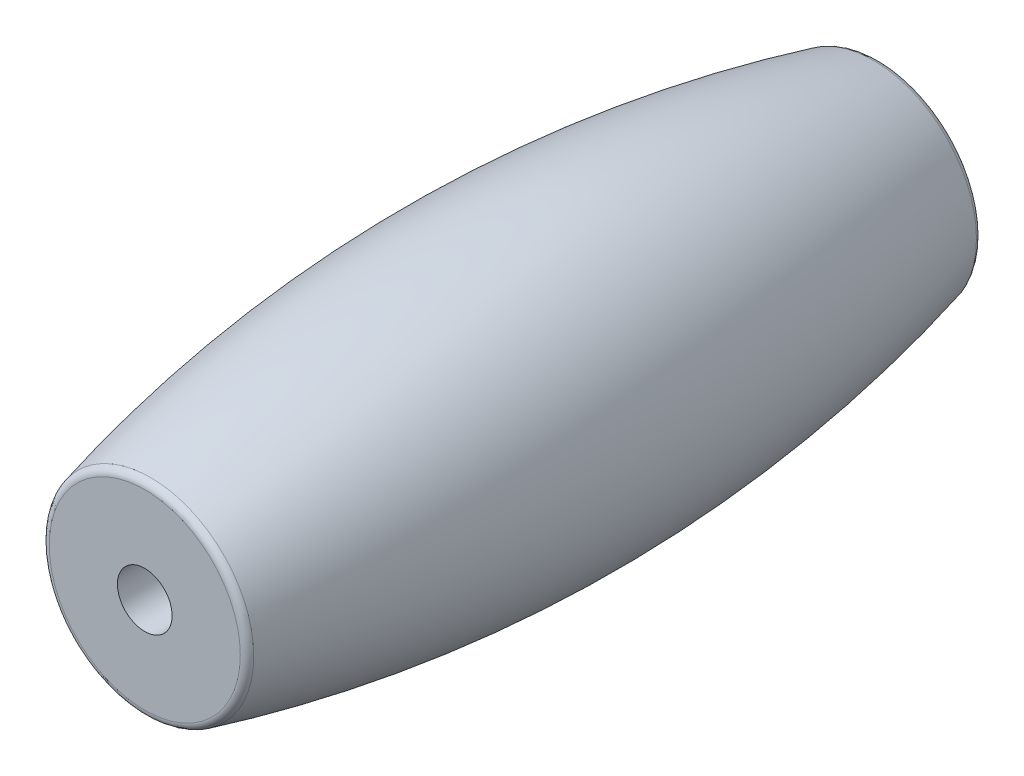
ISO-10303-21;
HEADER;
FILE_DESCRIPTION(('STEP AP214'),'2;1');
FILE_NAME('part.step','',(''),(''),'','','');
FILE_SCHEMA(('AUTOMOTIVE_DESIGN { 1 0 10303 214 1 1 1 1 }'));
ENDSEC;
DATA;
#1=APPLICATION_CONTEXT('core data for automotive mechanical design processes');
#2=APPLICATION_PROTOCOL_DEFINITION('international standard','automotive_design',2000,#1);
#3=PRODUCT_CONTEXT('',#1,'mechanical');
#4=PRODUCT('Part','Part','',(#3));
#5=PRODUCT_RELATED_PRODUCT_CATEGORY('part','',(#4));
#6=PRODUCT_DEFINITION_FORMATION('','',#4);
#7=PRODUCT_DEFINITION_CONTEXT('part definition',#1,'design');
#8=PRODUCT_DEFINITION('design','',#6,#7);
#9=PRODUCT_DEFINITION_SHAPE('','',#8);
#10=(LENGTH_UNIT() NAMED_UNIT(*) SI_UNIT(.MILLI.,.METRE.));
#11=(NAMED_UNIT(*) PLANE_ANGLE_UNIT() SI_UNIT($,.RADIAN.));
#12=(NAMED_UNIT(*) SI_UNIT($,.STERADIAN.) SOLID_ANGLE_UNIT());
#13=UNCERTAINTY_MEASURE_WITH_UNIT(LENGTH_MEASURE(1.E-05),#10,'distance_accuracy_value','');
#14=(GEOMETRIC_REPRESENTATION_CONTEXT(3) GLOBAL_UNCERTAINTY_ASSIGNED_CONTEXT((#13)) GLOBAL_UNIT_ASSIGNED_CONTEXT((#10,
#11,#12)) REPRESENTATION_CONTEXT('',''));
#15=CARTESIAN_POINT('',(0.,0.,0.));
#16=DIRECTION('',(0.,0.,1.));
#17=DIRECTION('',(1.,0.,0.));
#18=AXIS2_PLACEMENT_3D('',#15,#16,#17);
#19=CARTESIAN_POINT('',(0.,0.,-14.8279808754877));
#20=DIRECTION('',(0.,0.,1.));
#21=DIRECTION('',(1.,0.,0.));
#22=AXIS2_PLACEMENT_3D('',#19,#20,#21);
#23=PLANE('',#22);
#24=CARTESIAN_POINT('',(0.,0.,-14.8279808754877));
#25=DIRECTION('',(0.,0.,1.));
#26=DIRECTION('',(1.,0.,0.));
#27=AXIS2_PLACEMENT_3D('',#24,#25,#26);
#28=CIRCLE('',#27,6.11237781338488);
#29=CARTESIAN_POINT('',(6.11237781338487,0.,-14.8279808754877));
#30=VERTEX_POINT('',#29);
#31=EDGE_CURVE('E10',#30,#30,#28,.F.);
#32=ORIENTED_EDGE('',*,*,#31,.T.);
#33=EDGE_LOOP('',(#32));
#34=FACE_BOUND('',#33,.T.);
#35=CARTESIAN_POINT('',(0.,0.,-14.8279808754877));
#36=DIRECTION('',(0.,0.,1.));
#37=DIRECTION('',(1.,0.,0.));
#38=AXIS2_PLACEMENT_3D('',#35,#36,#37);
#39=CIRCLE('',#38,1.75);
#40=CARTESIAN_POINT('',(1.75,0.,-14.8279808754877));
#41=VERTEX_POINT('',#40);
#42=EDGE_CURVE('E55',#41,#41,#39,.T.);
#43=ORIENTED_EDGE('',*,*,#42,.T.);
#44=EDGE_LOOP('',(#43));
#45=FACE_BOUND('',#44,.T.);
#46=ADVANCED_FACE('F35',(#34,#45),#23,.F.);
#47=CARTESIAN_POINT('',(0.,0.,8.67201912451233));
#48=DIRECTION('',(0.,0.,-1.));
#49=DIRECTION('',(-1.,0.,0.));
#50=AXIS2_PLACEMENT_3D('',#47,#48,#49);
#51=DEGENERATE_TOROIDAL_SURFACE('',#50,84.0416666666667,93.5416666666667,.F.);
#52=CARTESIAN_POINT('',(0.,0.,31.795619661906));
#53=DIRECTION('',(0.,0.,-1.));
#54=DIRECTION('',(-1.,0.,0.));
#55=AXIS2_PLACEMENT_3D('',#52,#53,#54);
#56=CIRCLE('',#55,6.59685991538247);
#57=CARTESIAN_POINT('',(-6.59685991538246,0.,31.795619661906));
#58=VERTEX_POINT('',#57);
#59=EDGE_CURVE('E46',#58,#58,#56,.T.);
#60=ORIENTED_EDGE('',*,*,#59,.T.);
#61=EDGE_LOOP('',(#60));
#62=FACE_BOUND('',#61,.T.);
#63=CARTESIAN_POINT('',(0.,0.,-14.4515814128813));
#64=DIRECTION('',(0.,0.,1.));
#65=DIRECTION('',(1.,0.,0.));
#66=AXIS2_PLACEMENT_3D('',#63,#64,#65);
#67=CIRCLE('',#66,6.59685991538247);
#68=CARTESIAN_POINT('',(6.59685991538246,0.,-14.4515814128813));
#69=VERTEX_POINT('',#68);
#70=EDGE_CURVE('E50',#69,#69,#67,.T.);
#71=ORIENTED_EDGE('',*,*,#70,.T.);
#72=EDGE_LOOP('',(#71));
#73=FACE_BOUND('',#72,.T.);
#74=ADVANCED_FACE('F72',(#62,#73),#51,.F.);
#75=CARTESIAN_POINT('',(0.,0.,32.1720191245123));
#76=DIRECTION('',(0.,0.,-1.));
#77=DIRECTION('',(-1.,0.,0.));
#78=AXIS2_PLACEMENT_3D('',#75,#76,#77);
#79=PLANE('',#78);
#80=CARTESIAN_POINT('',(0.,0.,32.1720191245123));
#81=DIRECTION('',(0.,0.,-1.));
#82=DIRECTION('',(-1.,0.,0.));
#83=AXIS2_PLACEMENT_3D('',#80,#81,#82);
#84=CIRCLE('',#83,6.11237781338488);
#85=CARTESIAN_POINT('',(-6.11237781338487,0.,32.1720191245123));
#86=VERTEX_POINT('',#85);
#87=EDGE_CURVE('E42',#86,#86,#84,.F.);
#88=ORIENTED_EDGE('',*,*,#87,.T.);
#89=EDGE_LOOP('',(#88));
#90=FACE_BOUND('',#89,.T.);
#91=CARTESIAN_POINT('',(0.,0.,32.1720191245123));
#92=DIRECTION('',(0.,0.,1.));
#93=DIRECTION('',(1.,0.,0.));
#94=AXIS2_PLACEMENT_3D('',#91,#92,#93);
#95=CIRCLE('',#94,1.75);
#96=CARTESIAN_POINT('',(1.75,0.,32.1720191245123));
#97=VERTEX_POINT('',#96);
#98=EDGE_CURVE('E56',#97,#97,#95,.T.);
#99=ORIENTED_EDGE('',*,*,#98,.F.);
#100=EDGE_LOOP('',(#99));
#101=FACE_BOUND('',#100,.T.);
#102=ADVANCED_FACE('F67',(#90,#101),#79,.F.);
#103=CARTESIAN_POINT('',(0.,0.,-14.8279808754877));
#104=DIRECTION('',(0.,0.,1.));
#105=DIRECTION('',(1.,0.,0.));
#106=AXIS2_PLACEMENT_3D('',#103,#104,#105);
#107=CYLINDRICAL_SURFACE('',#106,1.75);
#108=ORIENTED_EDGE('',*,*,#42,.F.);
#109=EDGE_LOOP('',(#108));
#110=FACE_BOUND('',#109,.T.);
#111=ORIENTED_EDGE('',*,*,#98,.T.);
#112=EDGE_LOOP('',(#111));
#113=FACE_BOUND('',#112,.T.);
#114=ADVANCED_FACE('F63',(#110,#113),#107,.F.);
#115=CARTESIAN_POINT('',(0.,0.,31.6720191245123));
#116=DIRECTION('',(0.,0.,-1.));
#117=DIRECTION('',(-1.,0.,0.));
#118=AXIS2_PLACEMENT_3D('',#115,#116,#117);
#119=TOROIDAL_SURFACE('',#118,6.11237781338488,0.5);
#120=ORIENTED_EDGE('',*,*,#87,.F.);
#121=EDGE_LOOP('',(#120));
#122=FACE_BOUND('',#121,.T.);
#123=ORIENTED_EDGE('',*,*,#59,.F.);
#124=EDGE_LOOP('',(#123));
#125=FACE_BOUND('',#124,.T.);
#126=ADVANCED_FACE('F66',(#122,#125),#119,.T.);
#127=CARTESIAN_POINT('',(0.,0.,-14.3279808754877));
#128=DIRECTION('',(0.,0.,1.));
#129=DIRECTION('',(1.,0.,0.));
#130=AXIS2_PLACEMENT_3D('',#127,#128,#129);
#131=TOROIDAL_SURFACE('',#130,6.11237781338488,0.5);
#132=ORIENTED_EDGE('',*,*,#70,.F.);
#133=EDGE_LOOP('',(#132));
#134=FACE_BOUND('',#133,.T.);
#135=ORIENTED_EDGE('',*,*,#31,.F.);
#136=EDGE_LOOP('',(#135));
#137=FACE_BOUND('',#136,.T.);
#138=ADVANCED_FACE('F37',(#134,#137),#131,.T.);
#139=CLOSED_SHELL('',(#46,#74,#102,#114,#126,#138));
#140=MANIFOLD_SOLID_BREP('B2',#139);
#141=ADVANCED_BREP_SHAPE_REPRESENTATION('',(#18,#140),#14);
#142=SHAPE_DEFINITION_REPRESENTATION(#9,#141);
ENDSEC;
END-ISO-10303-21;
